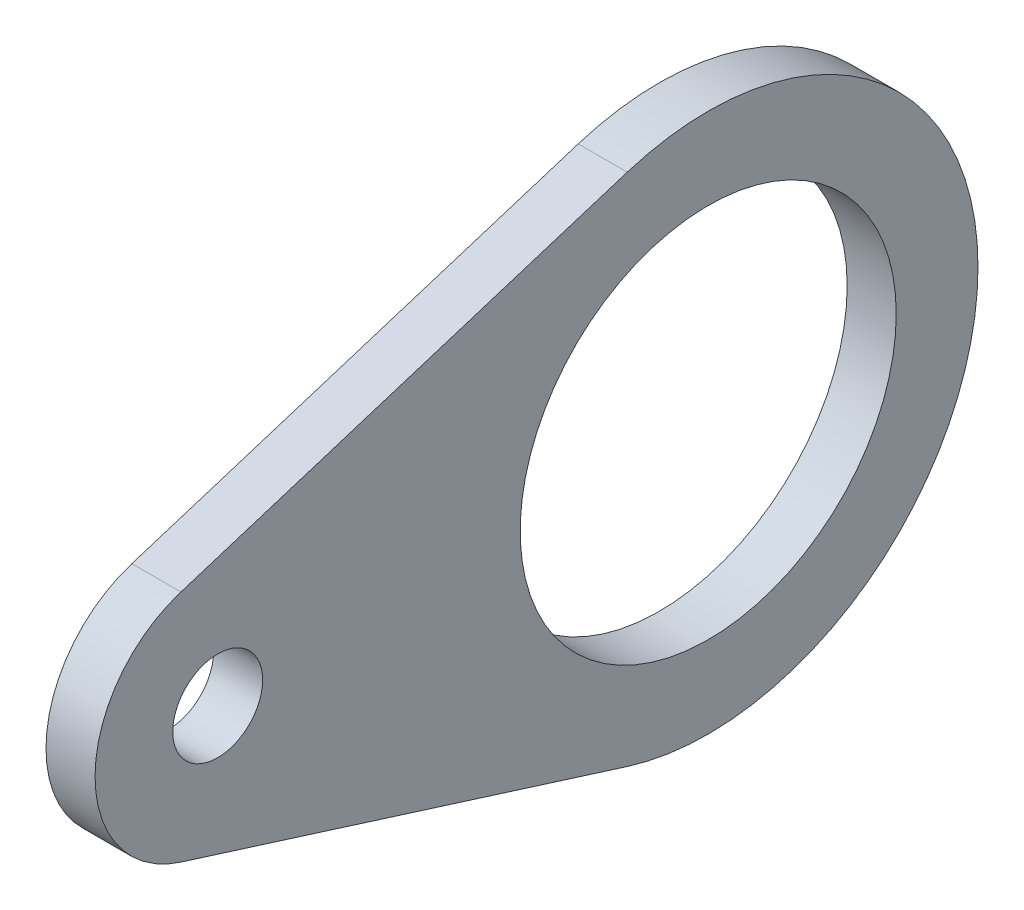
ISO-10303-21;
HEADER;
FILE_DESCRIPTION(('STEP AP214'),'2;1');
FILE_NAME('part.step','',(''),(''),'','','');
FILE_SCHEMA(('AUTOMOTIVE_DESIGN { 1 0 10303 214 1 1 1 1 }'));
ENDSEC;
DATA;
#1=APPLICATION_CONTEXT('core data for automotive mechanical design processes');
#2=APPLICATION_PROTOCOL_DEFINITION('international standard','automotive_design',2000,#1);
#3=PRODUCT_CONTEXT('',#1,'mechanical');
#4=PRODUCT('Part','Part','',(#3));
#5=PRODUCT_RELATED_PRODUCT_CATEGORY('part','',(#4));
#6=PRODUCT_DEFINITION_FORMATION('','',#4);
#7=PRODUCT_DEFINITION_CONTEXT('part definition',#1,'design');
#8=PRODUCT_DEFINITION('design','',#6,#7);
#9=PRODUCT_DEFINITION_SHAPE('','',#8);
#10=(LENGTH_UNIT() NAMED_UNIT(*) SI_UNIT(.MILLI.,.METRE.));
#11=(NAMED_UNIT(*) PLANE_ANGLE_UNIT() SI_UNIT($,.RADIAN.));
#12=(NAMED_UNIT(*) SI_UNIT($,.STERADIAN.) SOLID_ANGLE_UNIT());
#13=UNCERTAINTY_MEASURE_WITH_UNIT(LENGTH_MEASURE(1.E-05),#10,'distance_accuracy_value','');
#14=(GEOMETRIC_REPRESENTATION_CONTEXT(3) GLOBAL_UNCERTAINTY_ASSIGNED_CONTEXT((#13)) GLOBAL_UNIT_ASSIGNED_CONTEXT((#10,
#11,#12)) REPRESENTATION_CONTEXT('',''));
#15=CARTESIAN_POINT('',(0.,0.,0.));
#16=DIRECTION('',(0.,0.,1.));
#17=DIRECTION('',(1.,0.,0.));
#18=AXIS2_PLACEMENT_3D('',#15,#16,#17);
#19=CARTESIAN_POINT('',(6.00000000000001,0.,60.0000000000003));
#20=DIRECTION('',(1.,0.,0.));
#21=DIRECTION('',(0.,0.,-1.00000000000001));
#22=AXIS2_PLACEMENT_3D('',#19,#20,#21);
#23=PLANE('',#22);
#24=CARTESIAN_POINT('',(6.00000000000001,0.,0.));
#25=DIRECTION('',(1.,0.,0.));
#26=DIRECTION('',(0.,0.,-1.00000000000001));
#27=AXIS2_PLACEMENT_3D('',#24,#25,#26);
#28=CIRCLE('',#27,23.);
#29=CARTESIAN_POINT('',(6.00000000000001,0.,-23.0000000000001));
#30=VERTEX_POINT('',#29);
#31=EDGE_CURVE('E99',#30,#30,#28,.T.);
#32=ORIENTED_EDGE('',*,*,#31,.F.);
#33=EDGE_LOOP('',(#32));
#34=FACE_BOUND('',#33,.T.);
#35=CARTESIAN_POINT('',(6.00000000000001,0.,60.0000000000003));
#36=DIRECTION('',(1.,0.,0.));
#37=DIRECTION('',(0.,0.,-1.00000000000001));
#38=AXIS2_PLACEMENT_3D('',#35,#36,#37);
#39=CIRCLE('',#38,15.);
#40=CARTESIAN_POINT('',(6.00000000000001,14.3090880212542,64.5000000000003));
#41=VERTEX_POINT('',#40);
#42=CARTESIAN_POINT('',(6.00000000000001,-14.3090880212543,64.5000000000003));
#43=VERTEX_POINT('',#42);
#44=EDGE_CURVE('E84',#41,#43,#39,.T.);
#45=ORIENTED_EDGE('',*,*,#44,.T.);
#46=DIRECTION('',(0.,-0.300000000000001,-0.95393920141695));
#47=VECTOR('',#46,1.);
#48=CARTESIAN_POINT('',(6.00000000000001,-14.3090880212543,64.5000000000003));
#49=LINE('',#48,#47);
#50=CARTESIAN_POINT('',(6.00000000000001,-31.4799936467594,9.90000000000006));
#51=VERTEX_POINT('',#50);
#52=EDGE_CURVE('E79',#43,#51,#49,.T.);
#53=ORIENTED_EDGE('',*,*,#52,.T.);
#54=CARTESIAN_POINT('',(6.00000000000001,0.,0.));
#55=DIRECTION('',(1.,0.,0.));
#56=DIRECTION('',(0.,0.,-1.00000000000001));
#57=AXIS2_PLACEMENT_3D('',#54,#55,#56);
#58=CIRCLE('',#57,33.);
#59=CARTESIAN_POINT('',(6.00000000000001,31.4799936467592,9.90000000000001));
#60=VERTEX_POINT('',#59);
#61=EDGE_CURVE('E82',#51,#60,#58,.T.);
#62=ORIENTED_EDGE('',*,*,#61,.T.);
#63=DIRECTION('',(0.,-0.300000000000001,0.95393920141695));
#64=VECTOR('',#63,1.);
#65=CARTESIAN_POINT('',(6.00000000000001,14.3090880212542,64.5000000000003));
#66=LINE('',#65,#64);
#67=EDGE_CURVE('E49',#60,#41,#66,.T.);
#68=ORIENTED_EDGE('',*,*,#67,.T.);
#69=EDGE_LOOP('',(#45,#53,#62,#68));
#70=FACE_BOUND('',#69,.T.);
#71=CARTESIAN_POINT('',(6.00000000000001,0.,60.0000000000003));
#72=DIRECTION('',(1.,0.,0.));
#73=DIRECTION('',(0.,0.,-1.00000000000001));
#74=AXIS2_PLACEMENT_3D('',#71,#72,#73);
#75=CIRCLE('',#74,5.5);
#76=CARTESIAN_POINT('',(6.00000000000001,0.,54.5000000000002));
#77=VERTEX_POINT('',#76);
#78=EDGE_CURVE('E114',#77,#77,#75,.T.);
#79=ORIENTED_EDGE('',*,*,#78,.F.);
#80=EDGE_LOOP('',(#79));
#81=FACE_BOUND('',#80,.T.);
#82=ADVANCED_FACE('F32',(#34,#70,#81),#23,.T.);
#83=CARTESIAN_POINT('',(0.,0.,60.0000000000003));
#84=DIRECTION('',(1.,0.,0.));
#85=DIRECTION('',(0.,0.,-1.00000000000001));
#86=AXIS2_PLACEMENT_3D('',#83,#84,#85);
#87=PLANE('',#86);
#88=CARTESIAN_POINT('',(0.,0.,60.0000000000003));
#89=DIRECTION('',(1.,0.,0.));
#90=DIRECTION('',(0.,0.,-1.00000000000001));
#91=AXIS2_PLACEMENT_3D('',#88,#89,#90);
#92=CIRCLE('',#91,15.);
#93=CARTESIAN_POINT('',(0.,14.3090880212542,64.5000000000003));
#94=VERTEX_POINT('',#93);
#95=CARTESIAN_POINT('',(0.,-14.3090880212543,64.5000000000003));
#96=VERTEX_POINT('',#95);
#97=EDGE_CURVE('E96',#94,#96,#92,.T.);
#98=ORIENTED_EDGE('',*,*,#97,.F.);
#99=DIRECTION('',(0.,-0.300000000000001,0.95393920141695));
#100=VECTOR('',#99,1.);
#101=CARTESIAN_POINT('',(0.,14.3090880212542,64.5000000000003));
#102=LINE('',#101,#100);
#103=CARTESIAN_POINT('',(0.,31.4799936467592,9.90000000000001));
#104=VERTEX_POINT('',#103);
#105=EDGE_CURVE('E72',#104,#94,#102,.T.);
#106=ORIENTED_EDGE('',*,*,#105,.F.);
#107=CARTESIAN_POINT('',(0.,0.,0.));
#108=DIRECTION('',(1.,0.,0.));
#109=DIRECTION('',(0.,0.,-1.00000000000001));
#110=AXIS2_PLACEMENT_3D('',#107,#108,#109);
#111=CIRCLE('',#110,33.);
#112=CARTESIAN_POINT('',(0.,-31.4799936467594,9.90000000000006));
#113=VERTEX_POINT('',#112);
#114=EDGE_CURVE('E66',#113,#104,#111,.T.);
#115=ORIENTED_EDGE('',*,*,#114,.F.);
#116=DIRECTION('',(0.,-0.300000000000001,-0.95393920141695));
#117=VECTOR('',#116,1.);
#118=CARTESIAN_POINT('',(0.,-14.3090880212543,64.5000000000003));
#119=LINE('',#118,#117);
#120=EDGE_CURVE('E88',#96,#113,#119,.T.);
#121=ORIENTED_EDGE('',*,*,#120,.F.);
#122=EDGE_LOOP('',(#98,#106,#115,#121));
#123=FACE_BOUND('',#122,.T.);
#124=CARTESIAN_POINT('',(0.,0.,0.));
#125=DIRECTION('',(1.,0.,0.));
#126=DIRECTION('',(0.,0.,-1.00000000000001));
#127=AXIS2_PLACEMENT_3D('',#124,#125,#126);
#128=CIRCLE('',#127,23.);
#129=CARTESIAN_POINT('',(0.,0.,-23.0000000000001));
#130=VERTEX_POINT('',#129);
#131=EDGE_CURVE('E111',#130,#130,#128,.T.);
#132=ORIENTED_EDGE('',*,*,#131,.T.);
#133=EDGE_LOOP('',(#132));
#134=FACE_BOUND('',#133,.T.);
#135=CARTESIAN_POINT('',(0.,0.,60.0000000000003));
#136=DIRECTION('',(1.,0.,0.));
#137=DIRECTION('',(0.,0.,-1.00000000000001));
#138=AXIS2_PLACEMENT_3D('',#135,#136,#137);
#139=CIRCLE('',#138,5.5);
#140=CARTESIAN_POINT('',(0.,0.,54.5000000000003));
#141=VERTEX_POINT('',#140);
#142=EDGE_CURVE('E117',#141,#141,#139,.T.);
#143=ORIENTED_EDGE('',*,*,#142,.T.);
#144=EDGE_LOOP('',(#143));
#145=FACE_BOUND('',#144,.T.);
#146=ADVANCED_FACE('F107',(#123,#134,#145),#87,.F.);
#147=CARTESIAN_POINT('',(6.00000000000001,0.,60.0000000000003));
#148=DIRECTION('',(-1.,0.,0.));
#149=DIRECTION('',(0.,0.,1.00000000000001));
#150=AXIS2_PLACEMENT_3D('',#147,#148,#149);
#151=CYLINDRICAL_SURFACE('',#150,15.);
#152=ORIENTED_EDGE('',*,*,#97,.T.);
#153=DIRECTION('',(-1.,0.,0.));
#154=VECTOR('',#153,1.);
#155=CARTESIAN_POINT('',(6.00000000000001,-14.3090880212543,64.5000000000003));
#156=LINE('',#155,#154);
#157=EDGE_CURVE('E11',#43,#96,#156,.T.);
#158=ORIENTED_EDGE('',*,*,#157,.F.);
#159=ORIENTED_EDGE('',*,*,#44,.F.);
#160=DIRECTION('',(-1.,0.,0.));
#161=VECTOR('',#160,1.);
#162=CARTESIAN_POINT('',(6.00000000000001,14.3090880212542,64.5000000000003));
#163=LINE('',#162,#161);
#164=EDGE_CURVE('E92',#41,#94,#163,.T.);
#165=ORIENTED_EDGE('',*,*,#164,.T.);
#166=EDGE_LOOP('',(#152,#158,#159,#165));
#167=FACE_BOUND('',#166,.T.);
#168=ADVANCED_FACE('F34',(#167),#151,.T.);
#169=CARTESIAN_POINT('',(6.00000000000001,-14.3090880212543,64.5000000000003));
#170=DIRECTION('',(0.,0.95393920141695,-0.300000000000001));
#171=DIRECTION('',(0.,0.300000000000001,0.95393920141695));
#172=AXIS2_PLACEMENT_3D('',#169,#170,#171);
#173=PLANE('',#172);
#174=ORIENTED_EDGE('',*,*,#120,.T.);
#175=DIRECTION('',(-1.,0.,0.));
#176=VECTOR('',#175,1.);
#177=CARTESIAN_POINT('',(6.00000000000001,-31.4799936467594,9.90000000000006));
#178=LINE('',#177,#176);
#179=EDGE_CURVE('E41',#51,#113,#178,.T.);
#180=ORIENTED_EDGE('',*,*,#179,.F.);
#181=ORIENTED_EDGE('',*,*,#52,.F.);
#182=ORIENTED_EDGE('',*,*,#157,.T.);
#183=EDGE_LOOP('',(#174,#180,#181,#182));
#184=FACE_BOUND('',#183,.T.);
#185=ADVANCED_FACE('F87',(#184),#173,.F.);
#186=CARTESIAN_POINT('',(6.00000000000001,0.,0.));
#187=DIRECTION('',(-1.,0.,0.));
#188=DIRECTION('',(0.,0.,1.00000000000001));
#189=AXIS2_PLACEMENT_3D('',#186,#187,#188);
#190=CYLINDRICAL_SURFACE('',#189,33.);
#191=ORIENTED_EDGE('',*,*,#114,.T.);
#192=DIRECTION('',(-1.,0.,0.));
#193=VECTOR('',#192,1.);
#194=CARTESIAN_POINT('',(6.00000000000001,31.4799936467592,9.90000000000001));
#195=LINE('',#194,#193);
#196=EDGE_CURVE('E89',#60,#104,#195,.T.);
#197=ORIENTED_EDGE('',*,*,#196,.F.);
#198=ORIENTED_EDGE('',*,*,#61,.F.);
#199=ORIENTED_EDGE('',*,*,#179,.T.);
#200=EDGE_LOOP('',(#191,#197,#198,#199));
#201=FACE_BOUND('',#200,.T.);
#202=ADVANCED_FACE('F90',(#201),#190,.T.);
#203=CARTESIAN_POINT('',(6.00000000000001,14.3090880212542,64.5000000000003));
#204=DIRECTION('',(0.,-0.95393920141695,-0.300000000000001));
#205=DIRECTION('',(0.,0.300000000000001,-0.953939201416951));
#206=AXIS2_PLACEMENT_3D('',#203,#204,#205);
#207=PLANE('',#206);
#208=ORIENTED_EDGE('',*,*,#105,.T.);
#209=ORIENTED_EDGE('',*,*,#164,.F.);
#210=ORIENTED_EDGE('',*,*,#67,.F.);
#211=ORIENTED_EDGE('',*,*,#196,.T.);
#212=EDGE_LOOP('',(#208,#209,#210,#211));
#213=FACE_BOUND('',#212,.T.);
#214=ADVANCED_FACE('F104',(#213),#207,.F.);
#215=CARTESIAN_POINT('',(6.00000000000001,0.,0.));
#216=DIRECTION('',(-1.,0.,0.));
#217=DIRECTION('',(0.,0.,1.00000000000001));
#218=AXIS2_PLACEMENT_3D('',#215,#216,#217);
#219=CYLINDRICAL_SURFACE('',#218,23.);
#220=ORIENTED_EDGE('',*,*,#31,.T.);
#221=EDGE_LOOP('',(#220));
#222=FACE_BOUND('',#221,.T.);
#223=ORIENTED_EDGE('',*,*,#131,.F.);
#224=EDGE_LOOP('',(#223));
#225=FACE_BOUND('',#224,.T.);
#226=ADVANCED_FACE('F134',(#222,#225),#219,.F.);
#227=CARTESIAN_POINT('',(6.00000000000001,0.,60.0000000000003));
#228=DIRECTION('',(-1.,0.,0.));
#229=DIRECTION('',(0.,0.,1.00000000000001));
#230=AXIS2_PLACEMENT_3D('',#227,#228,#229);
#231=CYLINDRICAL_SURFACE('',#230,5.5);
#232=ORIENTED_EDGE('',*,*,#78,.T.);
#233=EDGE_LOOP('',(#232));
#234=FACE_BOUND('',#233,.T.);
#235=ORIENTED_EDGE('',*,*,#142,.F.);
#236=EDGE_LOOP('',(#235));
#237=FACE_BOUND('',#236,.T.);
#238=ADVANCED_FACE('F123',(#234,#237),#231,.F.);
#239=CLOSED_SHELL('',(#82,#146,#168,#185,#202,#214,#226,#238));
#240=MANIFOLD_SOLID_BREP('B2',#239);
#241=ADVANCED_BREP_SHAPE_REPRESENTATION('',(#18,#240),#14);
#242=SHAPE_DEFINITION_REPRESENTATION(#9,#241);
ENDSEC;
END-ISO-10303-21;
